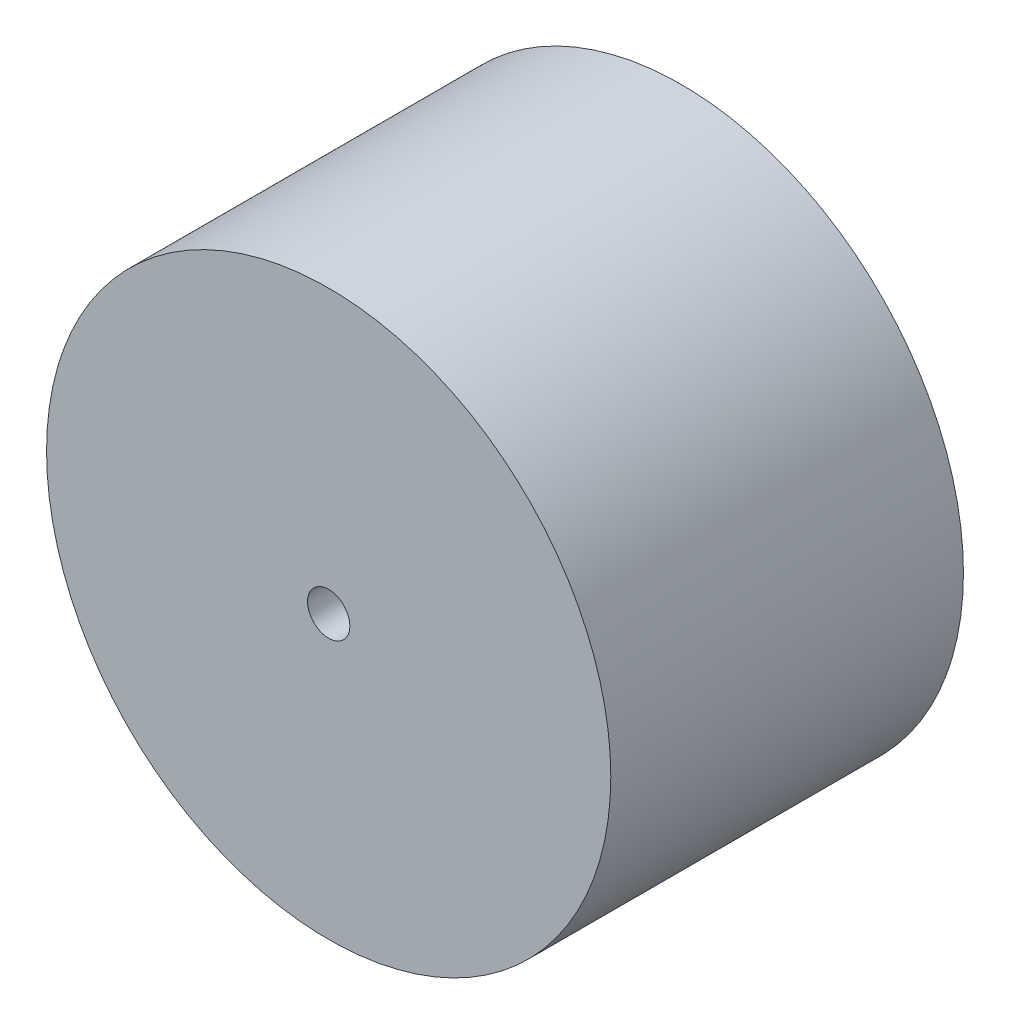
ISO-10303-21;
HEADER;
FILE_DESCRIPTION(('STEP AP214'),'2;1');
FILE_NAME('part.step','',(''),(''),'','','');
FILE_SCHEMA(('AUTOMOTIVE_DESIGN { 1 0 10303 214 1 1 1 1 }'));
ENDSEC;
DATA;
#1=APPLICATION_CONTEXT('core data for automotive mechanical design processes');
#2=APPLICATION_PROTOCOL_DEFINITION('international standard','automotive_design',2000,#1);
#3=PRODUCT_CONTEXT('',#1,'mechanical');
#4=PRODUCT('Part','Part','',(#3));
#5=PRODUCT_RELATED_PRODUCT_CATEGORY('part','',(#4));
#6=PRODUCT_DEFINITION_FORMATION('','',#4);
#7=PRODUCT_DEFINITION_CONTEXT('part definition',#1,'design');
#8=PRODUCT_DEFINITION('design','',#6,#7);
#9=PRODUCT_DEFINITION_SHAPE('','',#8);
#10=(LENGTH_UNIT() NAMED_UNIT(*) SI_UNIT(.MILLI.,.METRE.));
#11=(NAMED_UNIT(*) PLANE_ANGLE_UNIT() SI_UNIT($,.RADIAN.));
#12=(NAMED_UNIT(*) SI_UNIT($,.STERADIAN.) SOLID_ANGLE_UNIT());
#13=UNCERTAINTY_MEASURE_WITH_UNIT(LENGTH_MEASURE(1.E-05),#10,'distance_accuracy_value','');
#14=(GEOMETRIC_REPRESENTATION_CONTEXT(3) GLOBAL_UNCERTAINTY_ASSIGNED_CONTEXT((#13)) GLOBAL_UNIT_ASSIGNED_CONTEXT((#10,
#11,#12)) REPRESENTATION_CONTEXT('',''));
#15=CARTESIAN_POINT('',(0.,0.,0.));
#16=DIRECTION('',(0.,0.,1.));
#17=DIRECTION('',(1.,0.,0.));
#18=AXIS2_PLACEMENT_3D('',#15,#16,#17);
#19=CARTESIAN_POINT('',(0.,0.,50.));
#20=DIRECTION('',(0.,0.,-1.));
#21=DIRECTION('',(-1.,0.,0.));
#22=AXIS2_PLACEMENT_3D('',#19,#20,#21);
#23=CYLINDRICAL_SURFACE('',#22,40.);
#24=CARTESIAN_POINT('',(0.,0.,50.));
#25=DIRECTION('',(0.,0.,1.));
#26=DIRECTION('',(1.,0.,0.));
#27=AXIS2_PLACEMENT_3D('',#24,#25,#26);
#28=CIRCLE('',#27,40.);
#29=CARTESIAN_POINT('',(40.,0.,50.));
#30=VERTEX_POINT('',#29);
#31=EDGE_CURVE('E10',#30,#30,#28,.T.);
#32=ORIENTED_EDGE('',*,*,#31,.F.);
#33=EDGE_LOOP('',(#32));
#34=FACE_BOUND('',#33,.T.);
#35=CARTESIAN_POINT('',(0.,0.,0.));
#36=DIRECTION('',(0.,0.,1.));
#37=DIRECTION('',(1.,0.,0.));
#38=AXIS2_PLACEMENT_3D('',#35,#36,#37);
#39=CIRCLE('',#38,40.);
#40=CARTESIAN_POINT('',(40.,0.,0.));
#41=VERTEX_POINT('',#40);
#42=EDGE_CURVE('E42',#41,#41,#39,.T.);
#43=ORIENTED_EDGE('',*,*,#42,.T.);
#44=EDGE_LOOP('',(#43));
#45=FACE_BOUND('',#44,.T.);
#46=ADVANCED_FACE('F39',(#34,#45),#23,.T.);
#47=CARTESIAN_POINT('',(0.,0.,50.));
#48=DIRECTION('',(0.,0.,1.));
#49=DIRECTION('',(1.,0.,0.));
#50=AXIS2_PLACEMENT_3D('',#47,#48,#49);
#51=PLANE('',#50);
#52=CARTESIAN_POINT('',(0.,0.,50.));
#53=DIRECTION('',(0.,0.,1.));
#54=DIRECTION('',(1.,0.,0.));
#55=AXIS2_PLACEMENT_3D('',#52,#53,#54);
#56=CIRCLE('',#55,3.);
#57=CARTESIAN_POINT('',(3.,0.,50.));
#58=VERTEX_POINT('',#57);
#59=EDGE_CURVE('E51',#58,#58,#56,.T.);
#60=ORIENTED_EDGE('',*,*,#59,.F.);
#61=EDGE_LOOP('',(#60));
#62=FACE_BOUND('',#61,.T.);
#63=ORIENTED_EDGE('',*,*,#31,.T.);
#64=EDGE_LOOP('',(#63));
#65=FACE_BOUND('',#64,.T.);
#66=ADVANCED_FACE('F66',(#62,#65),#51,.T.);
#67=CARTESIAN_POINT('',(0.,0.,0.));
#68=DIRECTION('',(0.,0.,1.));
#69=DIRECTION('',(1.,0.,0.));
#70=AXIS2_PLACEMENT_3D('',#67,#68,#69);
#71=PLANE('',#70);
#72=CARTESIAN_POINT('',(0.,0.,0.));
#73=DIRECTION('',(0.,0.,1.));
#74=DIRECTION('',(1.,0.,0.));
#75=AXIS2_PLACEMENT_3D('',#72,#73,#74);
#76=CIRCLE('',#75,3.);
#77=CARTESIAN_POINT('',(3.,0.,0.));
#78=VERTEX_POINT('',#77);
#79=EDGE_CURVE('E49',#78,#78,#76,.T.);
#80=ORIENTED_EDGE('',*,*,#79,.T.);
#81=EDGE_LOOP('',(#80));
#82=FACE_BOUND('',#81,.T.);
#83=ORIENTED_EDGE('',*,*,#42,.F.);
#84=EDGE_LOOP('',(#83));
#85=FACE_BOUND('',#84,.T.);
#86=ADVANCED_FACE('F57',(#82,#85),#71,.F.);
#87=CARTESIAN_POINT('',(0.,0.,0.));
#88=DIRECTION('',(0.,0.,1.));
#89=DIRECTION('',(1.,0.,0.));
#90=AXIS2_PLACEMENT_3D('',#87,#88,#89);
#91=CYLINDRICAL_SURFACE('',#90,3.);
#92=ORIENTED_EDGE('',*,*,#79,.F.);
#93=EDGE_LOOP('',(#92));
#94=FACE_BOUND('',#93,.T.);
#95=ORIENTED_EDGE('',*,*,#59,.T.);
#96=EDGE_LOOP('',(#95));
#97=FACE_BOUND('',#96,.T.);
#98=ADVANCED_FACE('F60',(#94,#97),#91,.F.);
#99=CLOSED_SHELL('',(#46,#66,#86,#98));
#100=MANIFOLD_SOLID_BREP('B2',#99);
#101=ADVANCED_BREP_SHAPE_REPRESENTATION('',(#18,#100),#14);
#102=SHAPE_DEFINITION_REPRESENTATION(#9,#101);
ENDSEC;
END-ISO-10303-21;
